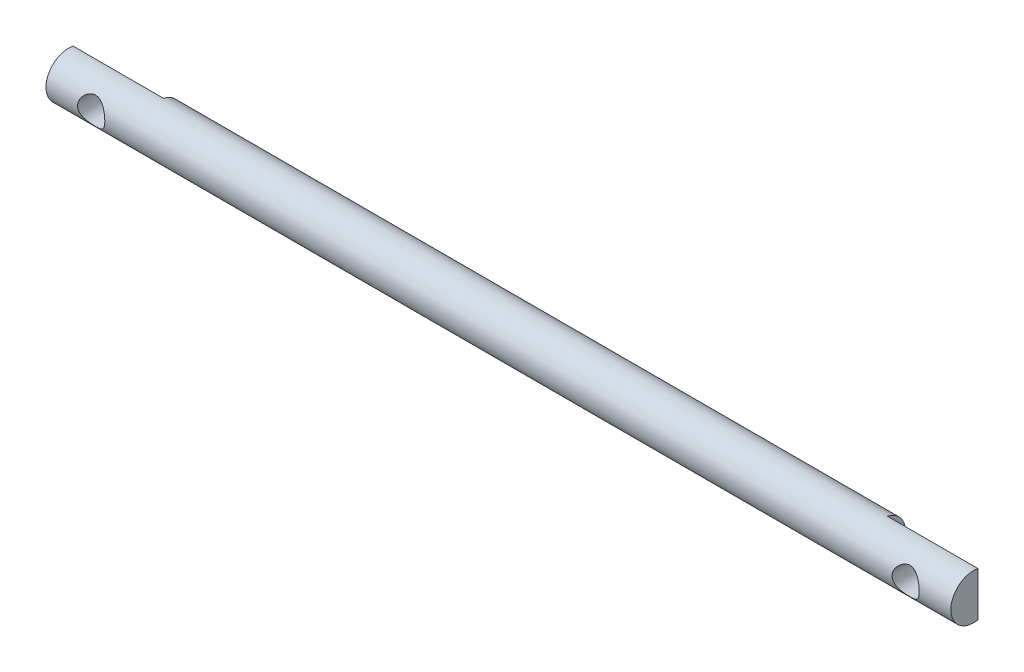
ISO-10303-21;
HEADER;
FILE_DESCRIPTION(('STEP AP214'),'2;1');
FILE_NAME('part.step','',(''),(''),'','','');
FILE_SCHEMA(('AUTOMOTIVE_DESIGN { 1 0 10303 214 1 1 1 1 }'));
ENDSEC;
DATA;
#1=APPLICATION_CONTEXT('core data for automotive mechanical design processes');
#2=APPLICATION_PROTOCOL_DEFINITION('international standard','automotive_design',2000,#1);
#3=PRODUCT_CONTEXT('',#1,'mechanical');
#4=PRODUCT('Part','Part','',(#3));
#5=PRODUCT_RELATED_PRODUCT_CATEGORY('part','',(#4));
#6=PRODUCT_DEFINITION_FORMATION('','',#4);
#7=PRODUCT_DEFINITION_CONTEXT('part definition',#1,'design');
#8=PRODUCT_DEFINITION('design','',#6,#7);
#9=PRODUCT_DEFINITION_SHAPE('','',#8);
#10=(LENGTH_UNIT() NAMED_UNIT(*) SI_UNIT(.MILLI.,.METRE.));
#11=(NAMED_UNIT(*) PLANE_ANGLE_UNIT() SI_UNIT($,.RADIAN.));
#12=(NAMED_UNIT(*) SI_UNIT($,.STERADIAN.) SOLID_ANGLE_UNIT());
#13=UNCERTAINTY_MEASURE_WITH_UNIT(LENGTH_MEASURE(1.E-05),#10,'distance_accuracy_value','');
#14=(GEOMETRIC_REPRESENTATION_CONTEXT(3) GLOBAL_UNCERTAINTY_ASSIGNED_CONTEXT((#13)) GLOBAL_UNIT_ASSIGNED_CONTEXT((#10,
#11,#12)) REPRESENTATION_CONTEXT('',''));
#15=CARTESIAN_POINT('',(0.,0.,0.));
#16=DIRECTION('',(0.,0.,1.));
#17=DIRECTION('',(1.,0.,0.));
#18=AXIS2_PLACEMENT_3D('',#15,#16,#17);
#19=CARTESIAN_POINT('',(40.,0.,0.));
#20=DIRECTION('',(-1.,0.,0.));
#21=DIRECTION('',(0.,0.,1.));
#22=AXIS2_PLACEMENT_3D('',#19,#20,#21);
#23=PLANE('',#22);
#24=CARTESIAN_POINT('',(40.,0.,0.));
#25=DIRECTION('',(-1.,0.,0.));
#26=DIRECTION('',(0.,0.,1.));
#27=AXIS2_PLACEMENT_3D('',#24,#25,#26);
#28=CIRCLE('',#27,2.50000000047519);
#29=CARTESIAN_POINT('',(40.,-2.44948974326281,-0.500000000026275));
#30=VERTEX_POINT('',#29);
#31=CARTESIAN_POINT('',(40.,2.44948974326281,-0.500000000026275));
#32=VERTEX_POINT('',#31);
#33=EDGE_CURVE('E81',#30,#32,#28,.F.);
#34=ORIENTED_EDGE('',*,*,#33,.T.);
#35=DIRECTION('',(0.,1.,0.));
#36=VECTOR('',#35,1.);
#37=CARTESIAN_POINT('',(40.,0.,-0.5));
#38=LINE('',#37,#36);
#39=EDGE_CURVE('E77',#32,#30,#38,.F.);
#40=ORIENTED_EDGE('',*,*,#39,.T.);
#41=EDGE_LOOP('',(#34,#40));
#42=FACE_BOUND('',#41,.T.);
#43=ADVANCED_FACE('F17',(#42),#23,.F.);
#44=CARTESIAN_POINT('',(0.,0.,-0.5));
#45=DIRECTION('',(0.,0.,1.));
#46=DIRECTION('',(1.,0.,0.));
#47=AXIS2_PLACEMENT_3D('',#44,#45,#46);
#48=PLANE('',#47);
#49=CARTESIAN_POINT('',(45.,0.,-0.5));
#50=DIRECTION('',(0.,0.,-1.));
#51=DIRECTION('',(0.,1.,0.));
#52=AXIS2_PLACEMENT_3D('',#49,#50,#51);
#53=CIRCLE('',#52,1.49999999750854);
#54=CARTESIAN_POINT('',(45.,1.49999999750854,-0.5));
#55=VERTEX_POINT('',#54);
#56=EDGE_CURVE('E20',#55,#55,#53,.F.);
#57=ORIENTED_EDGE('',*,*,#56,.T.);
#58=EDGE_LOOP('',(#57));
#59=FACE_BOUND('',#58,.T.);
#60=DIRECTION('',(0.,1.,0.));
#61=VECTOR('',#60,1.);
#62=CARTESIAN_POINT('',(50.,0.,-0.5));
#63=LINE('',#62,#61);
#64=CARTESIAN_POINT('',(50.,2.44948974326281,-0.500000000026275));
#65=VERTEX_POINT('',#64);
#66=CARTESIAN_POINT('',(50.,-2.44948974326281,-0.500000000026275));
#67=VERTEX_POINT('',#66);
#68=EDGE_CURVE('E74',#65,#67,#63,.F.);
#69=ORIENTED_EDGE('',*,*,#68,.T.);
#70=DIRECTION('',(-1.,0.,0.));
#71=VECTOR('',#70,1.);
#72=CARTESIAN_POINT('',(0.,-2.44948974325744,-0.500000000052551));
#73=LINE('',#72,#71);
#74=EDGE_CURVE('E83',#67,#30,#73,.T.);
#75=ORIENTED_EDGE('',*,*,#74,.T.);
#76=ORIENTED_EDGE('',*,*,#39,.F.);
#77=DIRECTION('',(1.,0.,0.));
#78=VECTOR('',#77,1.);
#79=CARTESIAN_POINT('',(0.,2.44948974325744,-0.50000000005255));
#80=LINE('',#79,#78);
#81=EDGE_CURVE('E78',#32,#65,#80,.T.);
#82=ORIENTED_EDGE('',*,*,#81,.T.);
#83=EDGE_LOOP('',(#69,#75,#76,#82));
#84=FACE_BOUND('',#83,.T.);
#85=ADVANCED_FACE('F115',(#59,#84),#48,.F.);
#86=CARTESIAN_POINT('',(50.,0.,0.));
#87=DIRECTION('',(-1.,0.,0.));
#88=DIRECTION('',(0.,0.,1.));
#89=AXIS2_PLACEMENT_3D('',#86,#87,#88);
#90=PLANE('',#89);
#91=CARTESIAN_POINT('',(50.,0.,0.));
#92=DIRECTION('',(-1.,0.,0.));
#93=DIRECTION('',(0.,0.,1.));
#94=AXIS2_PLACEMENT_3D('',#91,#92,#93);
#95=CIRCLE('',#94,2.50000000047519);
#96=EDGE_CURVE('E80',#65,#67,#95,.F.);
#97=ORIENTED_EDGE('',*,*,#96,.T.);
#98=ORIENTED_EDGE('',*,*,#68,.F.);
#99=EDGE_LOOP('',(#97,#98));
#100=FACE_BOUND('',#99,.T.);
#101=ADVANCED_FACE('F112',(#100),#90,.F.);
#102=CARTESIAN_POINT('',(45.,0.,2.52229260350952));
#103=DIRECTION('',(0.,0.,-1.));
#104=DIRECTION('',(0.,1.,0.));
#105=AXIS2_PLACEMENT_3D('',#102,#103,#104);
#106=CYLINDRICAL_SURFACE('',#105,1.49999999750854);
#107=CARTESIAN_POINT('',(46.3163738398845,-0.719138308057383,2.39433500081567));
#108=CARTESIAN_POINT('',(46.3517789956724,-0.654323065361512,2.41379916695879));
#109=CARTESIAN_POINT('',(46.3826649636566,-0.586393654286537,2.43132026194033));
#110=CARTESIAN_POINT('',(46.4342623269259,-0.445556254005448,2.46102880570116));
#111=CARTESIAN_POINT('',(46.4549622599421,-0.372642760808749,2.47321024412994));
#112=CARTESIAN_POINT('',(46.4852142141585,-0.223479958538133,2.49112634043747));
#113=CARTESIAN_POINT('',(46.4947292282701,-0.147220436929541,2.49683959501107));
#114=CARTESIAN_POINT('',(46.5019462843784,0.00602608177582616,2.5011664242425));
#115=CARTESIAN_POINT('',(46.4996547093742,0.0830126633341086,2.49978383512951));
#116=CARTESIAN_POINT('',(46.483827071541,0.231393137644143,2.49032269647219));
#117=CARTESIAN_POINT('',(46.4708685430576,0.302872386430203,2.48258810831914));
#118=CARTESIAN_POINT('',(46.4350735947591,0.442446514602877,2.46154980930466));
#119=CARTESIAN_POINT('',(46.4122343306257,0.510540413167821,2.44824449486147));
#120=CARTESIAN_POINT('',(46.3564855719872,0.644534681397146,2.41650720749317));
#121=CARTESIAN_POINT('',(46.3232084087,0.71023705711768,2.39789076568687));
#122=CARTESIAN_POINT('',(46.2480271272734,0.835320380596201,2.35723827798801));
#123=CARTESIAN_POINT('',(46.2061198984801,0.894699037267624,2.33520099978316));
#124=CARTESIAN_POINT('',(46.1085963944126,1.01375032329187,2.28625799676798));
#125=CARTESIAN_POINT('',(46.0519019474973,1.07243423573965,2.25909318070885));
#126=CARTESIAN_POINT('',(45.929681077004,1.1799708587433,2.20483685015312));
#127=CARTESIAN_POINT('',(45.8641421251486,1.22880937397123,2.17774549627944));
#128=CARTESIAN_POINT('',(45.7189528124821,1.31949668209414,2.1241326479174));
#129=CARTESIAN_POINT('',(45.6385658286783,1.36033755347708,2.09787611305673));
#130=CARTESIAN_POINT('',(45.470000997963,1.427328104363,2.05289731385314));
#131=CARTESIAN_POINT('',(45.381844738457,1.45351709262765,2.03415492890195));
#132=CARTESIAN_POINT('',(45.2246224991228,1.48464358841135,2.01149080838373));
#133=CARTESIAN_POINT('',(45.156676200059,1.49337036087957,2.00495994354288));
#134=CARTESIAN_POINT('',(45.0199315865128,1.50142673961713,1.99893694928853));
#135=CARTESIAN_POINT('',(44.9511338761263,1.50076266537656,1.9994400864009));
#136=CARTESIAN_POINT('',(44.8147859038685,1.49009112825234,2.00740326045508));
#137=CARTESIAN_POINT('',(44.7472342572961,1.48009476478302,2.0148550329833));
#138=CARTESIAN_POINT('',(44.6149746081827,1.45132510437655,2.03567302537054));
#139=CARTESIAN_POINT('',(44.5502686463756,1.43254561754371,2.04904341601236));
#140=CARTESIAN_POINT('',(44.4213955216828,1.38570554983679,2.08102464746912));
#141=CARTESIAN_POINT('',(44.3574599192178,1.35718553391225,2.09988628659157));
#142=CARTESIAN_POINT('',(44.2348466809768,1.29204063170066,2.14058547151601));
#143=CARTESIAN_POINT('',(44.1761749517595,1.25540679689405,2.1624262926841));
#144=CARTESIAN_POINT('',(44.0537704810853,1.16680068615925,2.2117012718353));
#145=CARTESIAN_POINT('',(43.991295143533,1.11322965295752,2.23939344240045));
#146=CARTESIAN_POINT('',(43.8758091858294,0.996451861636953,2.29373395104069));
#147=CARTESIAN_POINT('',(43.8227794306322,0.933265076457999,2.32038431208361));
#148=CARTESIAN_POINT('',(43.7419499359864,0.818903702534647,2.36260430048211));
#149=CARTESIAN_POINT('',(43.7113977763281,0.769979040334208,2.37906741225));
#150=CARTESIAN_POINT('',(43.6482210043077,0.654323065384906,2.41379916698156));
#151=CARTESIAN_POINT('',(43.6173350363399,0.58639365429717,2.43132026194542));
#152=CARTESIAN_POINT('',(43.5657376730814,0.445556254004888,2.46102880569393));
#153=CARTESIAN_POINT('',(43.54503774006,0.372642760809627,2.47321024412793));
#154=CARTESIAN_POINT('',(43.5147857858397,0.223479958538537,2.49112634043933));
#155=CARTESIAN_POINT('',(43.5052707717293,0.147220436928072,2.49683959501167));
#156=CARTESIAN_POINT('',(43.4980537156221,-0.0060260817780018,2.50116642424199));
#157=CARTESIAN_POINT('',(43.500345290626,-0.0830126633351001,2.49978383512933));
#158=CARTESIAN_POINT('',(43.5161729284588,-0.231393137643668,2.49032269647233));
#159=CARTESIAN_POINT('',(43.5291314569423,-0.302872386429416,2.48258810831925));
#160=CARTESIAN_POINT('',(43.5649264052407,-0.442446514602174,2.46154980930477));
#161=CARTESIAN_POINT('',(43.5877656693742,-0.510540413167476,2.44824449486154));
#162=CARTESIAN_POINT('',(43.6435144280128,-0.644534681397258,2.41650720749315));
#163=CARTESIAN_POINT('',(43.6767915913001,-0.710237057117908,2.3978907656868));
#164=CARTESIAN_POINT('',(43.7519728727267,-0.835320380596411,2.35723827798794));
#165=CARTESIAN_POINT('',(43.79388010152,-0.894699037267724,2.33520099978312));
#166=CARTESIAN_POINT('',(43.8914036055873,-1.01375032329183,2.286257996768));
#167=CARTESIAN_POINT('',(43.9480980525027,-1.07243423573958,2.25909318070888));
#168=CARTESIAN_POINT('',(44.0703189229959,-1.17997085874324,2.20483685015315));
#169=CARTESIAN_POINT('',(44.1358578748513,-1.2288093739712,2.17774549627945));
#170=CARTESIAN_POINT('',(44.2810471875179,-1.31949668209415,2.12413264791739));
#171=CARTESIAN_POINT('',(44.3614341713218,-1.3603375534771,2.09787611305672));
#172=CARTESIAN_POINT('',(44.529999002037,-1.42732810436302,2.05289731385313));
#173=CARTESIAN_POINT('',(44.618155261543,-1.45351709262767,2.03415492890194));
#174=CARTESIAN_POINT('',(44.7753775008771,-1.48464358841135,2.01149080838373));
#175=CARTESIAN_POINT('',(44.8433237999409,-1.49337036087956,2.00495994354289));
#176=CARTESIAN_POINT('',(44.9800684134871,-1.50142673961713,1.99893694928853));
#177=CARTESIAN_POINT('',(45.0488661238737,-1.50076266537658,1.99944008640089));
#178=CARTESIAN_POINT('',(45.1852140961315,-1.49009112825234,2.00740326045508));
#179=CARTESIAN_POINT('',(45.2527657427041,-1.48009476478298,2.01485503298332));
#180=CARTESIAN_POINT('',(45.3850253918175,-1.4513251043765,2.0356730253706));
#181=CARTESIAN_POINT('',(45.4497313536245,-1.43254561754371,2.04904341601241));
#182=CARTESIAN_POINT('',(45.5786044783168,-1.38570554983691,2.08102464746899));
#183=CARTESIAN_POINT('',(45.6425400807814,-1.35718553391246,2.09988628659123));
#184=CARTESIAN_POINT('',(45.7651533190227,-1.29204063170118,2.1405854715159));
#185=CARTESIAN_POINT('',(45.8238250482406,-1.25540679689471,2.16242629268446));
#186=CARTESIAN_POINT('',(45.9462295189149,-1.16680068615826,2.21170127183498));
#187=CARTESIAN_POINT('',(46.0087048564662,-1.11322965295434,2.23939344239866));
#188=CARTESIAN_POINT('',(46.1241908141739,-0.996451861637644,2.29373395104363));
#189=CARTESIAN_POINT('',(46.1772205693763,-0.933265076464934,2.32038431209277));
#190=CARTESIAN_POINT('',(46.2580500640083,-0.818903702528902,2.3626043004761));
#191=CARTESIAN_POINT('',(46.2886022236546,-0.76997904031627,2.37906741223056));
#192=CARTESIAN_POINT('',(46.3163738398845,-0.719138308057383,2.39433500081567));
#193=B_SPLINE_CURVE_WITH_KNOTS('',3,(#107,#108,#109,#110,#111,#112,#113,#114,#115,#116,#117,
#118,#119,#120,#121,#122,#123,#124,#125,#126,#127,#128,#129,#130,#131,#132,#133,#134,#135,#136,
#137,#138,#139,#140,#141,#142,#143,#144,#145,#146,#147,#148,#149,#150,#151,#152,#153,#154,#155,
#156,#157,#158,#159,#160,#161,#162,#163,#164,#165,#166,#167,#168,#169,#170,#171,#172,#173,#174,
#175,#176,#177,#178,#179,#180,#181,#182,#183,#184,#185,#186,#187,#188,#189,#190,#191,#192),
.UNSPECIFIED.,.T.,.F.,(4,2,2,2,2,2,2,2,2,2,2,2,2,2,2,2,2,2,2,2,2,2,2,2,2,2,2,2,2,2,2,2,2,2,2,2,
2,2,2,2,2,2,4),(0.,0.228962084905083,0.458181233271433,0.688156673960393,0.918007796024227,
1.13617445782229,1.35440396400697,1.5813997951634,1.8084775892318,2.06542476279548,
2.32273980012332,2.60293924110616,2.88238330008547,3.08789791461784,3.29327423643064,
3.4984066034491,3.70368375560242,3.92041601749234,4.13738850864271,4.39683227531097,
4.65574432516323,4.83534096897424,5.06430305387891,5.29352220225187,5.52349764294357,
5.75334876500467,5.97151542680158,6.18974493298741,6.41674076414425,6.64381855821224,
6.90076573177578,7.15808076910377,7.43828021008669,7.71772426906591,7.92323888359816,
8.12861520541107,8.33374757242989,8.53902472458284,8.75575698647159,8.97272947762313,
9.23217324429419,9.49108529414365,9.67068193795653),.UNSPECIFIED.);
#194=CARTESIAN_POINT('',(46.3163738398845,-0.719138308057383,2.39433500081567));
#195=VERTEX_POINT('',#194);
#196=EDGE_CURVE('E62',#195,#195,#193,.T.);
#197=ORIENTED_EDGE('',*,*,#196,.T.);
#198=EDGE_LOOP('',(#197));
#199=FACE_BOUND('',#198,.T.);
#200=ORIENTED_EDGE('',*,*,#56,.F.);
#201=EDGE_LOOP('',(#200));
#202=FACE_BOUND('',#201,.T.);
#203=ADVANCED_FACE('F108',(#199,#202),#106,.F.);
#204=CARTESIAN_POINT('',(-40.,0.,0.));
#205=DIRECTION('',(-1.,0.,0.));
#206=DIRECTION('',(0.,0.,1.));
#207=AXIS2_PLACEMENT_3D('',#204,#205,#206);
#208=PLANE('',#207);
#209=CARTESIAN_POINT('',(-40.,0.,0.));
#210=DIRECTION('',(-1.,0.,0.));
#211=DIRECTION('',(0.,0.,1.));
#212=AXIS2_PLACEMENT_3D('',#209,#210,#211);
#213=CIRCLE('',#212,2.50000000047519);
#214=CARTESIAN_POINT('',(-40.,2.44948974313408,-0.5));
#215=VERTEX_POINT('',#214);
#216=CARTESIAN_POINT('',(-40.,-2.44948974313408,-0.5));
#217=VERTEX_POINT('',#216);
#218=EDGE_CURVE('E57',#215,#217,#213,.T.);
#219=ORIENTED_EDGE('',*,*,#218,.T.);
#220=DIRECTION('',(0.,1.,0.));
#221=VECTOR('',#220,1.);
#222=CARTESIAN_POINT('',(-40.,0.,-0.5));
#223=LINE('',#222,#221);
#224=EDGE_CURVE('E54',#217,#215,#223,.T.);
#225=ORIENTED_EDGE('',*,*,#224,.T.);
#226=EDGE_LOOP('',(#219,#225));
#227=FACE_BOUND('',#226,.T.);
#228=ADVANCED_FACE('F56',(#227),#208,.T.);
#229=CARTESIAN_POINT('',(-50.,0.,0.));
#230=DIRECTION('',(-1.,0.,0.));
#231=DIRECTION('',(0.,0.,1.));
#232=AXIS2_PLACEMENT_3D('',#229,#230,#231);
#233=PLANE('',#232);
#234=DIRECTION('',(0.,1.,0.));
#235=VECTOR('',#234,1.);
#236=CARTESIAN_POINT('',(-50.,0.,-0.5));
#237=LINE('',#236,#235);
#238=CARTESIAN_POINT('',(-50.,2.44948974313408,-0.5));
#239=VERTEX_POINT('',#238);
#240=CARTESIAN_POINT('',(-50.,-2.44948974313408,-0.5));
#241=VERTEX_POINT('',#240);
#242=EDGE_CURVE('E69',#239,#241,#237,.F.);
#243=ORIENTED_EDGE('',*,*,#242,.T.);
#244=CARTESIAN_POINT('',(-50.,0.,0.));
#245=DIRECTION('',(-1.,0.,0.));
#246=DIRECTION('',(0.,0.,1.));
#247=AXIS2_PLACEMENT_3D('',#244,#245,#246);
#248=CIRCLE('',#247,2.50000000047519);
#249=EDGE_CURVE('E34',#241,#239,#248,.T.);
#250=ORIENTED_EDGE('',*,*,#249,.T.);
#251=EDGE_LOOP('',(#243,#250));
#252=FACE_BOUND('',#251,.T.);
#253=ADVANCED_FACE('F101',(#252),#233,.T.);
#254=CARTESIAN_POINT('',(50.,0.,0.));
#255=DIRECTION('',(-1.,0.,0.));
#256=DIRECTION('',(0.,0.,1.));
#257=AXIS2_PLACEMENT_3D('',#254,#255,#256);
#258=CYLINDRICAL_SURFACE('',#257,2.50000000047519);
#259=ORIENTED_EDGE('',*,*,#81,.F.);
#260=ORIENTED_EDGE('',*,*,#33,.F.);
#261=ORIENTED_EDGE('',*,*,#74,.F.);
#262=ORIENTED_EDGE('',*,*,#96,.F.);
#263=EDGE_LOOP('',(#259,#260,#261,#262));
#264=FACE_BOUND('',#263,.T.);
#265=ORIENTED_EDGE('',*,*,#196,.F.);
#266=EDGE_LOOP('',(#265));
#267=FACE_BOUND('',#266,.T.);
#268=CARTESIAN_POINT('',(-43.6836261602842,-0.719138307935961,2.39433500063672));
#269=CARTESIAN_POINT('',(-43.7259950831978,-0.796694072560087,2.37103980198549));
#270=CARTESIAN_POINT('',(-43.774872646637,-0.869856171608948,2.34493598803757));
#271=CARTESIAN_POINT('',(-43.8839537094955,-1.00601855541288,2.28983413202049));
#272=CARTESIAN_POINT('',(-43.9441739038879,-1.06900360362486,2.26083185368261));
#273=CARTESIAN_POINT('',(-44.0745305430353,-1.18365436010119,2.20297057420365));
#274=CARTESIAN_POINT('',(-44.1446590669472,-1.23532902671936,2.17411147749355));
#275=CARTESIAN_POINT('',(-44.2937593370036,-1.3262062435246,2.11990029014305));
#276=CARTESIAN_POINT('',(-44.3727182893538,-1.36542652941086,2.09454324176345));
#277=CARTESIAN_POINT('',(-44.5208552293276,-1.42315039355217,2.05562550368583));
#278=CARTESIAN_POINT('',(-44.5886555281804,-1.44426546514735,2.040708433318));
#279=CARTESIAN_POINT('',(-44.7275941641642,-1.47677639043703,2.01731010621747));
#280=CARTESIAN_POINT('',(-44.7987280217449,-1.48818491359386,2.00882046169413));
#281=CARTESIAN_POINT('',(-44.9427289674044,-1.50065358019277,1.99952639476848));
#282=CARTESIAN_POINT('',(-45.0156021515071,-1.50166940125717,1.99875488868194));
#283=CARTESIAN_POINT('',(-45.1603936745909,-1.49316372305481,2.00511505971175));
#284=CARTESIAN_POINT('',(-45.2323115864358,-1.48363766067574,2.01225015924768));
#285=CARTESIAN_POINT('',(-45.3688680457321,-1.45551183812267,2.03267290725154));
#286=CARTESIAN_POINT('',(-45.4336858306706,-1.43747972669931,2.04557330766177));
#287=CARTESIAN_POINT('',(-45.5593972297479,-1.39338339415567,2.07586018127625));
#288=CARTESIAN_POINT('',(-45.6202893496201,-1.36731613610711,2.09324835025255));
#289=CARTESIAN_POINT('',(-45.745952737278,-1.3035403541063,2.13363591918999));
#290=CARTESIAN_POINT('',(-45.8099982583792,-1.26468956559667,2.15708368353117));
#291=CARTESIAN_POINT('',(-45.9312863218162,-1.17824473411211,2.20549262258942));
#292=CARTESIAN_POINT('',(-45.9885228564574,-1.13064306294045,2.23045510487727));
#293=CARTESIAN_POINT('',(-46.1045548592388,-1.0185855210762,2.28406690046865));
#294=CARTESIAN_POINT('',(-46.1619686330736,-0.952640410999732,2.31262354814027));
#295=CARTESIAN_POINT('',(-46.2650423366826,-0.810770409842623,2.36609233285276));
#296=CARTESIAN_POINT('',(-46.3107024389837,-0.73484566527341,2.3910045233867));
#297=CARTESIAN_POINT('',(-46.3876102719697,-0.576303617436149,2.43402304600473));
#298=CARTESIAN_POINT('',(-46.4191448424513,-0.493863767503878,2.45226330393121));
#299=CARTESIAN_POINT('',(-46.4673779363869,-0.323440515487113,2.48048580947553));
#300=CARTESIAN_POINT('',(-46.4840970240546,-0.235464979410614,2.49047950217539));
#301=CARTESIAN_POINT('',(-46.5003545738302,-0.0698219891296481,2.50020667596348));
#302=CARTESIAN_POINT('',(-46.5019606734682,0.0075756184082788,2.50117476667647));
#303=CARTESIAN_POINT('',(-46.4932742653598,0.161444006079247,2.49596765463608));
#304=CARTESIAN_POINT('',(-46.482984282962,0.237914979440242,2.48979396796799));
#305=CARTESIAN_POINT('',(-46.451735602086,0.384522372311265,2.47131279615202));
#306=CARTESIAN_POINT('',(-46.431228683357,0.454789939546778,2.45926548186921));
#307=CARTESIAN_POINT('',(-46.3806968956636,0.590712099885076,2.43020539985747));
#308=CARTESIAN_POINT('',(-46.3506673822803,0.656364422883451,2.41319020948687));
#309=CARTESIAN_POINT('',(-46.2740049170475,0.796694072654757,2.37103980222639));
#310=CARTESIAN_POINT('',(-46.225127353468,0.869856171582736,2.34493598812239));
#311=CARTESIAN_POINT('',(-46.116046290491,1.00601855532467,2.28983413198188));
#312=CARTESIAN_POINT('',(-46.0558260961187,1.06900360359395,2.26083185367641));
#313=CARTESIAN_POINT('',(-45.925469456975,1.18365436011729,2.2029705742173));
#314=CARTESIAN_POINT('',(-45.8553409330493,1.23532902672812,2.17411147749463));
#315=CARTESIAN_POINT('',(-45.7062406629848,1.32620624352509,2.11990029013645));
#316=CARTESIAN_POINT('',(-45.6272817106412,1.36542652941167,2.09454324176138));
#317=CARTESIAN_POINT('',(-45.4791447706743,1.42315039355238,2.0556255036869));
#318=CARTESIAN_POINT('',(-45.4113444718222,1.44426546514677,2.04070843331874));
#319=CARTESIAN_POINT('',(-45.2724058358381,1.47677639043644,2.01731010621758));
#320=CARTESIAN_POINT('',(-45.2012719782564,1.48818491359371,2.00882046169416));
#321=CARTESIAN_POINT('',(-45.0572710325953,1.50065358019286,1.9995263947685));
#322=CARTESIAN_POINT('',(-44.9843978484921,1.50166940125719,1.99875488868195));
#323=CARTESIAN_POINT('',(-44.8396063254083,1.4931637230547,2.00511505971181));
#324=CARTESIAN_POINT('',(-44.7676884135638,1.48363766067568,2.01225015924773));
#325=CARTESIAN_POINT('',(-44.631131954268,1.45551183812269,2.03267290725152));
#326=CARTESIAN_POINT('',(-44.5663141693295,1.43747972669934,2.04557330766175));
#327=CARTESIAN_POINT('',(-44.4406027702522,1.39338339415571,2.07586018127622));
#328=CARTESIAN_POINT('',(-44.3797106503799,1.36731613610714,2.09324835025253));
#329=CARTESIAN_POINT('',(-44.2540472627222,1.3035403541064,2.13363591918993));
#330=CARTESIAN_POINT('',(-44.1900017416211,1.26468956559686,2.15708368353105));
#331=CARTESIAN_POINT('',(-44.068713678184,1.17824473411235,2.20549262258929));
#332=CARTESIAN_POINT('',(-44.0114771435427,1.1306430629406,2.23045510487719));
#333=CARTESIAN_POINT('',(-43.8954451407606,1.01858552107556,2.28406690046896));
#334=CARTESIAN_POINT('',(-43.8380313669252,0.952640410998299,2.31262354814091));
#335=CARTESIAN_POINT('',(-43.7349576633165,0.810770409841008,2.36609233285327));
#336=CARTESIAN_POINT('',(-43.6892975610159,0.734845665272619,2.39100452338684));
#337=CARTESIAN_POINT('',(-43.6123897280314,0.576303617438585,2.43402304600414));
#338=CARTESIAN_POINT('',(-43.5808551575504,0.493863767508885,2.45226330393038));
#339=CARTESIAN_POINT('',(-43.5326220636145,0.323440515492957,2.48048580947456));
#340=CARTESIAN_POINT('',(-43.5159029759468,0.235464979414363,2.49047950217397));
#341=CARTESIAN_POINT('',(-43.4996454261683,0.0698219891242173,2.50020667596483));
#342=CARTESIAN_POINT('',(-43.4980393265281,-0.0075756184204126,2.50117476668034));
#343=CARTESIAN_POINT('',(-43.5067257346449,-0.161444006085825,2.49596765463158));
#344=CARTESIAN_POINT('',(-43.517015717052,-0.237914979434673,2.48979396795347));
#345=CARTESIAN_POINT('',(-43.5482643979028,-0.384522372327138,2.47131279616462));
#346=CARTESIAN_POINT('',(-43.568771316601,-0.454789939594384,2.45926548191612));
#347=CARTESIAN_POINT('',(-43.6193031043955,-0.590712099883492,2.43020539980069));
#348=CARTESIAN_POINT('',(-43.6493326179125,-0.656364422800142,2.41319020929123));
#349=CARTESIAN_POINT('',(-43.6836261602842,-0.719138307935961,2.39433500063672));
#350=B_SPLINE_CURVE_WITH_KNOTS('',3,(#268,#269,#270,#271,#272,#273,#274,#275,#276,#277,#278,
#279,#280,#281,#282,#283,#284,#285,#286,#287,#288,#289,#290,#291,#292,#293,#294,#295,#296,#297,
#298,#299,#300,#301,#302,#303,#304,#305,#306,#307,#308,#309,#310,#311,#312,#313,#314,#315,#316,
#317,#318,#319,#320,#321,#322,#323,#324,#325,#326,#327,#328,#329,#330,#331,#332,#333,#334,#335,
#336,#337,#338,#339,#340,#341,#342,#343,#344,#345,#346,#347,#348,#349),.UNSPECIFIED.,.T.,.F.,(4,
2,2,2,2,2,2,2,2,2,2,2,2,2,2,2,2,2,2,2,2,2,2,2,2,2,2,2,2,2,2,2,2,2,2,2,2,2,2,2,4),(0.,
0.273881664834288,0.548169645744474,0.822239585148912,1.09591746572412,1.31271724952688,
1.52923361960626,1.74667299702136,1.96420653109582,2.16892392554335,2.37371878913584,
2.60832700403526,2.84314070649603,3.11777524346124,3.3924057489558,3.66117402657889,
3.92956866096332,4.16060160099966,4.39158550543057,4.61315797175198,4.83483867141651,
5.10872033628658,5.38300831728147,5.65707825669979,5.93075613726112,6.14755592106,
6.36407229114325,6.58151166855947,6.79904520263282,7.0037625970802,7.20855746067283,
7.44316567557168,7.67797937803302,7.95261391500119,8.2272444204928,8.49601269810739,
8.76440733250032,8.99544027255066,9.22642417696758,9.44799664330808,9.66967734302704),.UNSPECIFIED.);
#351=CARTESIAN_POINT('',(-43.6836261602842,-0.719138307935961,2.39433500063672));
#352=VERTEX_POINT('',#351);
#353=EDGE_CURVE('E26',#352,#352,#350,.T.);
#354=ORIENTED_EDGE('',*,*,#353,.T.);
#355=EDGE_LOOP('',(#354));
#356=FACE_BOUND('',#355,.T.);
#357=DIRECTION('',(1.,0.,0.));
#358=VECTOR('',#357,1.);
#359=CARTESIAN_POINT('',(0.,2.449489743,-0.5));
#360=LINE('',#359,#358);
#361=EDGE_CURVE('E61',#215,#239,#360,.F.);
#362=ORIENTED_EDGE('',*,*,#361,.T.);
#363=ORIENTED_EDGE('',*,*,#249,.F.);
#364=DIRECTION('',(1.,0.,0.));
#365=VECTOR('',#364,1.);
#366=CARTESIAN_POINT('',(0.,-2.449489743,-0.5));
#367=LINE('',#366,#365);
#368=EDGE_CURVE('E66',#241,#217,#367,.T.);
#369=ORIENTED_EDGE('',*,*,#368,.T.);
#370=ORIENTED_EDGE('',*,*,#218,.F.);
#371=EDGE_LOOP('',(#362,#363,#369,#370));
#372=FACE_BOUND('',#371,.T.);
#373=ADVANCED_FACE('F64',(#264,#267,#356,#372),#258,.T.);
#374=CARTESIAN_POINT('',(0.,0.,-0.5));
#375=DIRECTION('',(0.,0.,1.));
#376=DIRECTION('',(1.,0.,0.));
#377=AXIS2_PLACEMENT_3D('',#374,#375,#376);
#378=PLANE('',#377);
#379=CARTESIAN_POINT('',(-45.,0.,-0.5));
#380=DIRECTION('',(0.,0.,-1.));
#381=DIRECTION('',(0.,1.,0.));
#382=AXIS2_PLACEMENT_3D('',#379,#380,#381);
#383=CIRCLE('',#382,1.49999999750854);
#384=CARTESIAN_POINT('',(-45.,1.49999999750854,-0.5));
#385=VERTEX_POINT('',#384);
#386=EDGE_CURVE('E11',#385,#385,#383,.F.);
#387=ORIENTED_EDGE('',*,*,#386,.T.);
#388=EDGE_LOOP('',(#387));
#389=FACE_BOUND('',#388,.T.);
#390=ORIENTED_EDGE('',*,*,#242,.F.);
#391=ORIENTED_EDGE('',*,*,#361,.F.);
#392=ORIENTED_EDGE('',*,*,#224,.F.);
#393=ORIENTED_EDGE('',*,*,#368,.F.);
#394=EDGE_LOOP('',(#390,#391,#392,#393));
#395=FACE_BOUND('',#394,.T.);
#396=ADVANCED_FACE('F68',(#389,#395),#378,.F.);
#397=CARTESIAN_POINT('',(-45.,0.,2.52229260350952));
#398=DIRECTION('',(0.,0.,-1.));
#399=DIRECTION('',(0.,1.,0.));
#400=AXIS2_PLACEMENT_3D('',#397,#398,#399);
#401=CYLINDRICAL_SURFACE('',#400,1.49999999750854);
#402=ORIENTED_EDGE('',*,*,#353,.F.);
#403=EDGE_LOOP('',(#402));
#404=FACE_BOUND('',#403,.T.);
#405=ORIENTED_EDGE('',*,*,#386,.F.);
#406=EDGE_LOOP('',(#405));
#407=FACE_BOUND('',#406,.T.);
#408=ADVANCED_FACE('F95',(#404,#407),#401,.F.);
#409=CLOSED_SHELL('',(#43,#85,#101,#203,#228,#253,#373,#396,#408));
#410=MANIFOLD_SOLID_BREP('B1',#409);
#411=ADVANCED_BREP_SHAPE_REPRESENTATION('',(#18,#410),#14);
#412=SHAPE_DEFINITION_REPRESENTATION(#9,#411);
ENDSEC;
END-ISO-10303-21;
